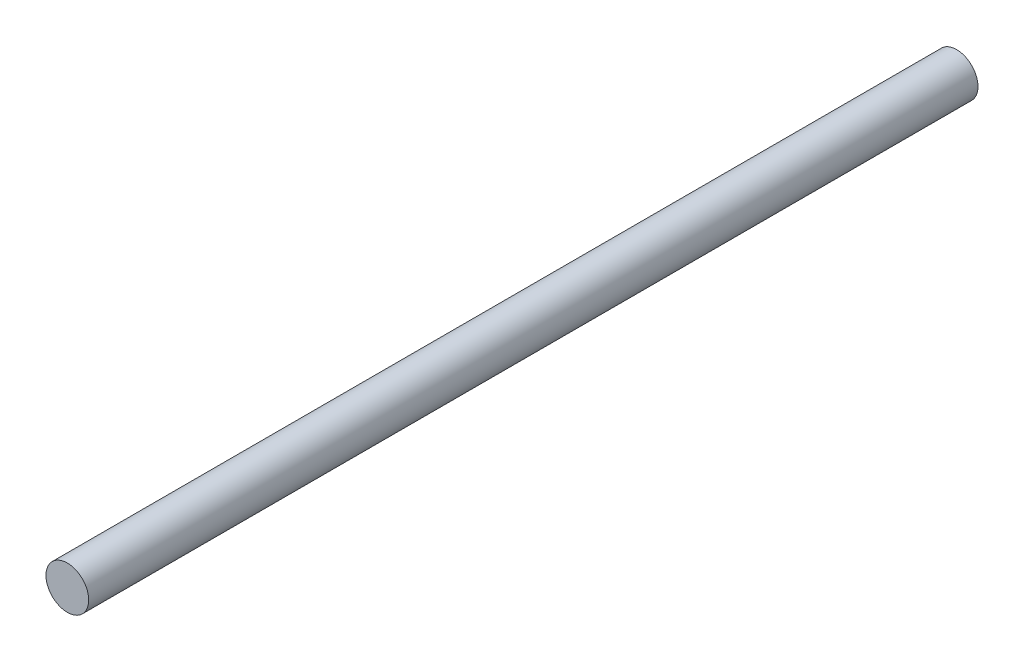
ISO-10303-21;
HEADER;
FILE_DESCRIPTION(('STEP AP214'),'2;1');
FILE_NAME('part.step','',(''),(''),'','','');
FILE_SCHEMA(('AUTOMOTIVE_DESIGN { 1 0 10303 214 1 1 1 1 }'));
ENDSEC;
DATA;
#1=APPLICATION_CONTEXT('core data for automotive mechanical design processes');
#2=APPLICATION_PROTOCOL_DEFINITION('international standard','automotive_design',2000,#1);
#3=PRODUCT_CONTEXT('',#1,'mechanical');
#4=PRODUCT('Part','Part','',(#3));
#5=PRODUCT_RELATED_PRODUCT_CATEGORY('part','',(#4));
#6=PRODUCT_DEFINITION_FORMATION('','',#4);
#7=PRODUCT_DEFINITION_CONTEXT('part definition',#1,'design');
#8=PRODUCT_DEFINITION('design','',#6,#7);
#9=PRODUCT_DEFINITION_SHAPE('','',#8);
#10=(LENGTH_UNIT() NAMED_UNIT(*) SI_UNIT(.MILLI.,.METRE.));
#11=(NAMED_UNIT(*) PLANE_ANGLE_UNIT() SI_UNIT($,.RADIAN.));
#12=(NAMED_UNIT(*) SI_UNIT($,.STERADIAN.) SOLID_ANGLE_UNIT());
#13=UNCERTAINTY_MEASURE_WITH_UNIT(LENGTH_MEASURE(1.E-05),#10,'distance_accuracy_value','');
#14=(GEOMETRIC_REPRESENTATION_CONTEXT(3) GLOBAL_UNCERTAINTY_ASSIGNED_CONTEXT((#13)) GLOBAL_UNIT_ASSIGNED_CONTEXT((#10,
#11,#12)) REPRESENTATION_CONTEXT('',''));
#15=CARTESIAN_POINT('',(0.,0.,0.));
#16=DIRECTION('',(0.,0.,1.));
#17=DIRECTION('',(1.,0.,0.));
#18=AXIS2_PLACEMENT_3D('',#15,#16,#17);
#19=CARTESIAN_POINT('',(0.,0.,52.));
#20=DIRECTION('',(0.,0.,-1.));
#21=DIRECTION('',(-1.,0.,0.));
#22=AXIS2_PLACEMENT_3D('',#19,#20,#21);
#23=CYLINDRICAL_SURFACE('',#22,1.25);
#24=CARTESIAN_POINT('',(0.,0.,52.));
#25=DIRECTION('',(0.,0.,1.));
#26=DIRECTION('',(1.,0.,0.));
#27=AXIS2_PLACEMENT_3D('',#24,#25,#26);
#28=CIRCLE('',#27,1.25);
#29=CARTESIAN_POINT('',(1.25,0.,52.));
#30=VERTEX_POINT('',#29);
#31=EDGE_CURVE('E10',#30,#30,#28,.T.);
#32=ORIENTED_EDGE('',*,*,#31,.F.);
#33=EDGE_LOOP('',(#32));
#34=FACE_BOUND('',#33,.T.);
#35=CARTESIAN_POINT('',(0.,0.,0.));
#36=DIRECTION('',(0.,0.,1.));
#37=DIRECTION('',(1.,0.,0.));
#38=AXIS2_PLACEMENT_3D('',#35,#36,#37);
#39=CIRCLE('',#38,1.25);
#40=CARTESIAN_POINT('',(1.25,0.,0.));
#41=VERTEX_POINT('',#40);
#42=EDGE_CURVE('E38',#41,#41,#39,.T.);
#43=ORIENTED_EDGE('',*,*,#42,.T.);
#44=EDGE_LOOP('',(#43));
#45=FACE_BOUND('',#44,.T.);
#46=ADVANCED_FACE('F35',(#34,#45),#23,.T.);
#47=CARTESIAN_POINT('',(0.,0.,52.));
#48=DIRECTION('',(0.,0.,1.));
#49=DIRECTION('',(1.,0.,0.));
#50=AXIS2_PLACEMENT_3D('',#47,#48,#49);
#51=PLANE('',#50);
#52=ORIENTED_EDGE('',*,*,#31,.T.);
#53=EDGE_LOOP('',(#52));
#54=FACE_BOUND('',#53,.T.);
#55=ADVANCED_FACE('F50',(#54),#51,.T.);
#56=CARTESIAN_POINT('',(0.,0.,0.));
#57=DIRECTION('',(0.,0.,1.));
#58=DIRECTION('',(1.,0.,0.));
#59=AXIS2_PLACEMENT_3D('',#56,#57,#58);
#60=PLANE('',#59);
#61=ORIENTED_EDGE('',*,*,#42,.F.);
#62=EDGE_LOOP('',(#61));
#63=FACE_BOUND('',#62,.T.);
#64=ADVANCED_FACE('F48',(#63),#60,.F.);
#65=CLOSED_SHELL('',(#46,#55,#64));
#66=MANIFOLD_SOLID_BREP('B2',#65);
#67=ADVANCED_BREP_SHAPE_REPRESENTATION('',(#18,#66),#14);
#68=SHAPE_DEFINITION_REPRESENTATION(#9,#67);
ENDSEC;
END-ISO-10303-21;
